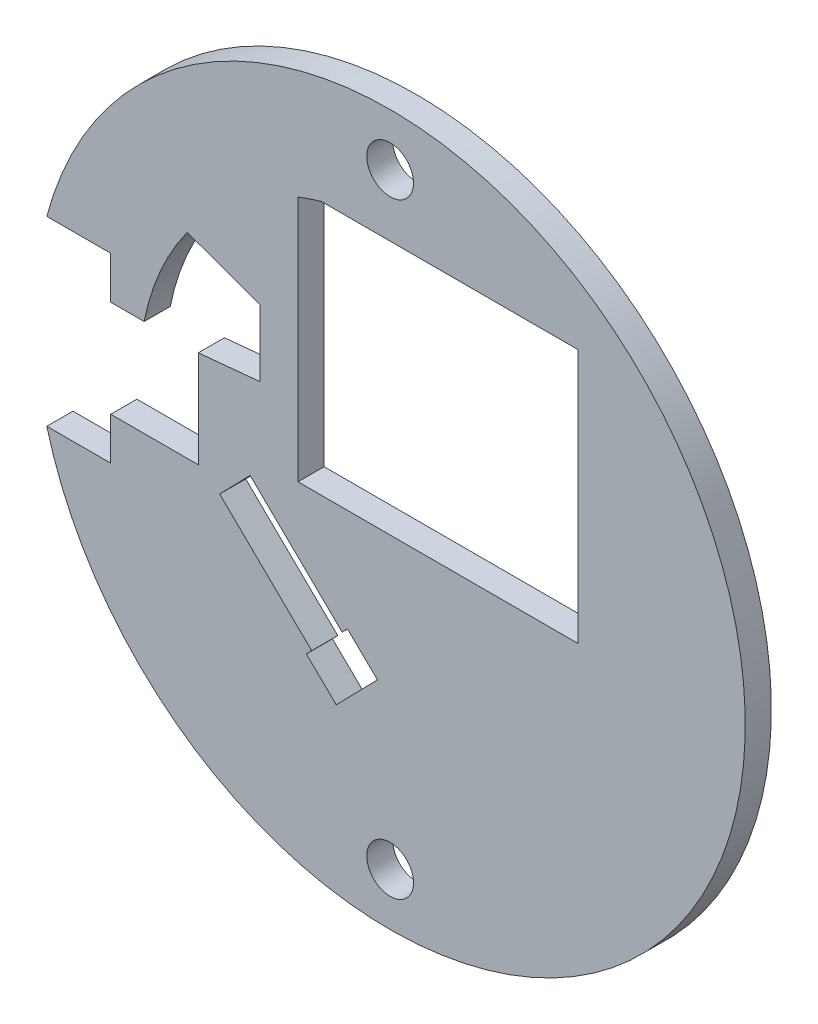
ISO-10303-21;
HEADER;
FILE_DESCRIPTION(('STEP AP214'),'2;1');
FILE_NAME('part.step','',(''),(''),'','','');
FILE_SCHEMA(('AUTOMOTIVE_DESIGN { 1 0 10303 214 1 1 1 1 }'));
ENDSEC;
DATA;
#1=APPLICATION_CONTEXT('core data for automotive mechanical design processes');
#2=APPLICATION_PROTOCOL_DEFINITION('international standard','automotive_design',2000,#1);
#3=PRODUCT_CONTEXT('',#1,'mechanical');
#4=PRODUCT('Part','Part','',(#3));
#5=PRODUCT_RELATED_PRODUCT_CATEGORY('part','',(#4));
#6=PRODUCT_DEFINITION_FORMATION('','',#4);
#7=PRODUCT_DEFINITION_CONTEXT('part definition',#1,'design');
#8=PRODUCT_DEFINITION('design','',#6,#7);
#9=PRODUCT_DEFINITION_SHAPE('','',#8);
#10=(LENGTH_UNIT() NAMED_UNIT(*) SI_UNIT(.MILLI.,.METRE.));
#11=(NAMED_UNIT(*) PLANE_ANGLE_UNIT() SI_UNIT($,.RADIAN.));
#12=(NAMED_UNIT(*) SI_UNIT($,.STERADIAN.) SOLID_ANGLE_UNIT());
#13=UNCERTAINTY_MEASURE_WITH_UNIT(LENGTH_MEASURE(1.E-05),#10,'distance_accuracy_value','');
#14=(GEOMETRIC_REPRESENTATION_CONTEXT(3) GLOBAL_UNCERTAINTY_ASSIGNED_CONTEXT((#13)) GLOBAL_UNIT_ASSIGNED_CONTEXT((#10,
#11,#12)) REPRESENTATION_CONTEXT('',''));
#15=CARTESIAN_POINT('',(0.,0.,0.));
#16=DIRECTION('',(0.,0.,1.));
#17=DIRECTION('',(1.,0.,0.));
#18=AXIS2_PLACEMENT_3D('',#15,#16,#17);
#19=CARTESIAN_POINT('',(-7.9248,0.,1.5875));
#20=DIRECTION('',(-1.,0.,0.));
#21=DIRECTION('',(0.,0.,1.));
#22=AXIS2_PLACEMENT_3D('',#19,#20,#21);
#23=PLANE('',#22);
#24=DIRECTION('',(0.,1.,0.));
#25=VECTOR('',#24,1.);
#26=CARTESIAN_POINT('',(-7.9248,0.,0.));
#27=LINE('',#26,#25);
#28=CARTESIAN_POINT('',(-7.9248,3.302,0.));
#29=VERTEX_POINT('',#28);
#30=CARTESIAN_POINT('',(-7.9248,7.366,0.));
#31=VERTEX_POINT('',#30);
#32=EDGE_CURVE('E286',#29,#31,#27,.T.);
#33=ORIENTED_EDGE('',*,*,#32,.F.);
#34=DIRECTION('',(0.,0.,-1.));
#35=VECTOR('',#34,1.);
#36=CARTESIAN_POINT('',(-7.9248,3.302,1.5875));
#37=LINE('',#36,#35);
#38=CARTESIAN_POINT('',(-7.9248,3.302,1.5875));
#39=VERTEX_POINT('',#38);
#40=EDGE_CURVE('E11',#39,#29,#37,.T.);
#41=ORIENTED_EDGE('',*,*,#40,.F.);
#42=DIRECTION('',(0.,1.,0.));
#43=VECTOR('',#42,1.);
#44=CARTESIAN_POINT('',(-7.9248,0.,1.5875));
#45=LINE('',#44,#43);
#46=CARTESIAN_POINT('',(-7.9248,7.366,1.5875));
#47=VERTEX_POINT('',#46);
#48=EDGE_CURVE('E419',#39,#47,#45,.T.);
#49=ORIENTED_EDGE('',*,*,#48,.T.);
#50=DIRECTION('',(0.,0.,-1.));
#51=VECTOR('',#50,1.);
#52=CARTESIAN_POINT('',(-7.9248,7.366,1.5875));
#53=LINE('',#52,#51);
#54=EDGE_CURVE('E139',#47,#31,#53,.T.);
#55=ORIENTED_EDGE('',*,*,#54,.T.);
#56=EDGE_LOOP('',(#33,#41,#49,#55));
#57=FACE_BOUND('',#56,.T.);
#58=ADVANCED_FACE('F35',(#57),#23,.T.);
#59=CARTESIAN_POINT('',(-0.380118648773103,4.01609515255772,1.5875));
#60=DIRECTION('',(-0.0942276918622993,0.995550672786827,0.));
#61=DIRECTION('',(-0.995550672786827,-0.0942276918622993,0.));
#62=AXIS2_PLACEMENT_3D('',#59,#60,#61);
#63=PLANE('',#62);
#64=DIRECTION('',(0.995550672786827,0.0942276918622993,0.));
#65=VECTOR('',#64,1.);
#66=CARTESIAN_POINT('',(-0.380118648773103,4.01609515255772,0.));
#67=LINE('',#66,#65);
#68=CARTESIAN_POINT('',(-11.6598615597199,2.9484808478801,0.));
#69=VERTEX_POINT('',#68);
#70=EDGE_CURVE('E289',#69,#29,#67,.T.);
#71=ORIENTED_EDGE('',*,*,#70,.F.);
#72=DIRECTION('',(0.,0.,-1.));
#73=VECTOR('',#72,1.);
#74=CARTESIAN_POINT('',(-11.6598615597199,2.9484808478801,1.5875));
#75=LINE('',#74,#73);
#76=CARTESIAN_POINT('',(-11.6598615597199,2.9484808478801,1.5875));
#77=VERTEX_POINT('',#76);
#78=EDGE_CURVE('E45',#77,#69,#75,.T.);
#79=ORIENTED_EDGE('',*,*,#78,.F.);
#80=DIRECTION('',(0.995550672786827,0.0942276918622993,0.));
#81=VECTOR('',#80,1.);
#82=CARTESIAN_POINT('',(-0.380118648773103,4.01609515255772,1.5875));
#83=LINE('',#82,#81);
#84=EDGE_CURVE('E421',#77,#39,#83,.T.);
#85=ORIENTED_EDGE('',*,*,#84,.T.);
#86=ORIENTED_EDGE('',*,*,#40,.T.);
#87=EDGE_LOOP('',(#71,#79,#85,#86));
#88=FACE_BOUND('',#87,.T.);
#89=ADVANCED_FACE('F450',(#88),#63,.T.);
#90=CARTESIAN_POINT('',(-11.6598615597199,0.,1.5875));
#91=DIRECTION('',(1.,0.,0.));
#92=DIRECTION('',(0.,1.,0.));
#93=AXIS2_PLACEMENT_3D('',#90,#91,#92);
#94=PLANE('',#93);
#95=DIRECTION('',(0.,-1.,0.));
#96=VECTOR('',#95,1.);
#97=CARTESIAN_POINT('',(-11.6598615597199,0.,0.));
#98=LINE('',#97,#96);
#99=CARTESIAN_POINT('',(-11.6598615597199,-2.9484808478801,0.));
#100=VERTEX_POINT('',#99);
#101=EDGE_CURVE('E292',#69,#100,#98,.T.);
#102=ORIENTED_EDGE('',*,*,#101,.T.);
#103=DIRECTION('',(0.,0.,-1.));
#104=VECTOR('',#103,1.);
#105=CARTESIAN_POINT('',(-11.6598615597199,-2.9484808478801,1.5875));
#106=LINE('',#105,#104);
#107=CARTESIAN_POINT('',(-11.6598615597199,-2.9484808478801,1.5875));
#108=VERTEX_POINT('',#107);
#109=EDGE_CURVE('E341',#108,#100,#106,.T.);
#110=ORIENTED_EDGE('',*,*,#109,.F.);
#111=DIRECTION('',(0.,-1.,0.));
#112=VECTOR('',#111,1.);
#113=CARTESIAN_POINT('',(-11.6598615597199,0.,1.5875));
#114=LINE('',#113,#112);
#115=EDGE_CURVE('E424',#77,#108,#114,.T.);
#116=ORIENTED_EDGE('',*,*,#115,.F.);
#117=ORIENTED_EDGE('',*,*,#78,.T.);
#118=EDGE_LOOP('',(#102,#110,#116,#117));
#119=FACE_BOUND('',#118,.T.);
#120=ADVANCED_FACE('F455',(#119),#94,.F.);
#121=CARTESIAN_POINT('',(0.,-2.9484808478801,1.5875));
#122=DIRECTION('',(0.,-1.,0.));
#123=DIRECTION('',(0.,0.,-1.));
#124=AXIS2_PLACEMENT_3D('',#121,#122,#123);
#125=PLANE('',#124);
#126=DIRECTION('',(-1.,0.,0.));
#127=VECTOR('',#126,1.);
#128=CARTESIAN_POINT('',(0.,-2.9484808478801,0.));
#129=LINE('',#128,#127);
#130=CARTESIAN_POINT('',(-16.9840587441892,-2.9484808478801,0.));
#131=VERTEX_POINT('',#130);
#132=EDGE_CURVE('E295',#100,#131,#129,.T.);
#133=ORIENTED_EDGE('',*,*,#132,.T.);
#134=DIRECTION('',(0.,0.,-1.));
#135=VECTOR('',#134,1.);
#136=CARTESIAN_POINT('',(-16.9840587441892,-2.9484808478801,1.5875));
#137=LINE('',#136,#135);
#138=CARTESIAN_POINT('',(-16.9840587441892,-2.9484808478801,1.5875));
#139=VERTEX_POINT('',#138);
#140=EDGE_CURVE('E338',#139,#131,#137,.T.);
#141=ORIENTED_EDGE('',*,*,#140,.F.);
#142=DIRECTION('',(-1.,0.,0.));
#143=VECTOR('',#142,1.);
#144=CARTESIAN_POINT('',(0.,-2.9484808478801,1.5875));
#145=LINE('',#144,#143);
#146=EDGE_CURVE('E427',#108,#139,#145,.T.);
#147=ORIENTED_EDGE('',*,*,#146,.F.);
#148=ORIENTED_EDGE('',*,*,#109,.T.);
#149=EDGE_LOOP('',(#133,#141,#147,#148));
#150=FACE_BOUND('',#149,.T.);
#151=ADVANCED_FACE('F459',(#150),#125,.F.);
#152=CARTESIAN_POINT('',(-16.9840587441892,0.,1.5875));
#153=DIRECTION('',(1.,0.,0.));
#154=DIRECTION('',(0.,0.,-1.));
#155=AXIS2_PLACEMENT_3D('',#152,#153,#154);
#156=PLANE('',#155);
#157=DIRECTION('',(0.,-1.,0.));
#158=VECTOR('',#157,1.);
#159=CARTESIAN_POINT('',(-16.9840587441892,0.,0.));
#160=LINE('',#159,#158);
#161=CARTESIAN_POINT('',(-16.9840587441892,-5.5245,0.));
#162=VERTEX_POINT('',#161);
#163=EDGE_CURVE('E298',#131,#162,#160,.T.);
#164=ORIENTED_EDGE('',*,*,#163,.T.);
#165=DIRECTION('',(0.,0.,-1.));
#166=VECTOR('',#165,1.);
#167=CARTESIAN_POINT('',(-16.9840587441892,-5.5245,1.5875));
#168=LINE('',#167,#166);
#169=CARTESIAN_POINT('',(-16.9840587441892,-5.5245,1.5875));
#170=VERTEX_POINT('',#169);
#171=EDGE_CURVE('E335',#170,#162,#168,.T.);
#172=ORIENTED_EDGE('',*,*,#171,.F.);
#173=DIRECTION('',(0.,-1.,0.));
#174=VECTOR('',#173,1.);
#175=CARTESIAN_POINT('',(-16.9840587441892,0.,1.5875));
#176=LINE('',#175,#174);
#177=EDGE_CURVE('E430',#139,#170,#176,.T.);
#178=ORIENTED_EDGE('',*,*,#177,.F.);
#179=ORIENTED_EDGE('',*,*,#140,.T.);
#180=EDGE_LOOP('',(#164,#172,#178,#179));
#181=FACE_BOUND('',#180,.T.);
#182=ADVANCED_FACE('F461',(#181),#156,.F.);
#183=CARTESIAN_POINT('',(0.,-5.5245,1.5875));
#184=DIRECTION('',(0.,-1.,0.));
#185=DIRECTION('',(1.,0.,0.));
#186=AXIS2_PLACEMENT_3D('',#183,#184,#185);
#187=PLANE('',#186);
#188=DIRECTION('',(-1.,0.,0.));
#189=VECTOR('',#188,1.);
#190=CARTESIAN_POINT('',(0.,-5.5245,0.));
#191=LINE('',#190,#189);
#192=CARTESIAN_POINT('',(-20.8712242034338,-5.5245,0.));
#193=VERTEX_POINT('',#192);
#194=EDGE_CURVE('E301',#162,#193,#191,.T.);
#195=ORIENTED_EDGE('',*,*,#194,.T.);
#196=DIRECTION('',(0.,0.,-1.));
#197=VECTOR('',#196,1.);
#198=CARTESIAN_POINT('',(-20.8712242034338,-5.5245,1.5875));
#199=LINE('',#198,#197);
#200=CARTESIAN_POINT('',(-20.8712242034338,-5.5245,1.5875));
#201=VERTEX_POINT('',#200);
#202=EDGE_CURVE('E332',#201,#193,#199,.T.);
#203=ORIENTED_EDGE('',*,*,#202,.F.);
#204=DIRECTION('',(-1.,0.,0.));
#205=VECTOR('',#204,1.);
#206=CARTESIAN_POINT('',(0.,-5.5245,1.5875));
#207=LINE('',#206,#205);
#208=EDGE_CURVE('E433',#170,#201,#207,.T.);
#209=ORIENTED_EDGE('',*,*,#208,.F.);
#210=ORIENTED_EDGE('',*,*,#171,.T.);
#211=EDGE_LOOP('',(#195,#203,#209,#210));
#212=FACE_BOUND('',#211,.T.);
#213=ADVANCED_FACE('F463',(#212),#187,.F.);
#214=CARTESIAN_POINT('',(0.,0.,1.5875));
#215=DIRECTION('',(0.,0.,-1.));
#216=DIRECTION('',(-1.,0.,0.));
#217=AXIS2_PLACEMENT_3D('',#214,#215,#216);
#218=CYLINDRICAL_SURFACE('',#217,21.59);
#219=CARTESIAN_POINT('',(0.,0.,0.));
#220=DIRECTION('',(0.,0.,1.));
#221=DIRECTION('',(1.,0.,0.));
#222=AXIS2_PLACEMENT_3D('',#219,#220,#221);
#223=CIRCLE('',#222,21.59);
#224=CARTESIAN_POINT('',(-20.8712242034338,5.5245,0.));
#225=VERTEX_POINT('',#224);
#226=EDGE_CURVE('E304',#193,#225,#223,.T.);
#227=ORIENTED_EDGE('',*,*,#226,.T.);
#228=DIRECTION('',(0.,0.,-1.));
#229=VECTOR('',#228,1.);
#230=CARTESIAN_POINT('',(-20.8712242034338,5.5245,1.5875));
#231=LINE('',#230,#229);
#232=CARTESIAN_POINT('',(-20.8712242034338,5.5245,1.5875));
#233=VERTEX_POINT('',#232);
#234=EDGE_CURVE('E330',#233,#225,#231,.T.);
#235=ORIENTED_EDGE('',*,*,#234,.F.);
#236=CARTESIAN_POINT('',(0.,0.,1.5875));
#237=DIRECTION('',(0.,0.,1.));
#238=DIRECTION('',(1.,0.,0.));
#239=AXIS2_PLACEMENT_3D('',#236,#237,#238);
#240=CIRCLE('',#239,21.59);
#241=EDGE_CURVE('E436',#201,#233,#240,.T.);
#242=ORIENTED_EDGE('',*,*,#241,.F.);
#243=ORIENTED_EDGE('',*,*,#202,.T.);
#244=EDGE_LOOP('',(#227,#235,#242,#243));
#245=FACE_BOUND('',#244,.T.);
#246=ADVANCED_FACE('F467',(#245),#218,.T.);
#247=CARTESIAN_POINT('',(0.,5.5245,1.5875));
#248=DIRECTION('',(0.,-1.,0.));
#249=DIRECTION('',(0.,0.,-1.));
#250=AXIS2_PLACEMENT_3D('',#247,#248,#249);
#251=PLANE('',#250);
#252=DIRECTION('',(-1.,0.,0.));
#253=VECTOR('',#252,1.);
#254=CARTESIAN_POINT('',(0.,5.5245,0.));
#255=LINE('',#254,#253);
#256=CARTESIAN_POINT('',(-16.9840587441892,5.5245,0.));
#257=VERTEX_POINT('',#256);
#258=EDGE_CURVE('E307',#257,#225,#255,.T.);
#259=ORIENTED_EDGE('',*,*,#258,.F.);
#260=DIRECTION('',(0.,0.,-1.));
#261=VECTOR('',#260,1.);
#262=CARTESIAN_POINT('',(-16.9840587441892,5.5245,1.5875));
#263=LINE('',#262,#261);
#264=CARTESIAN_POINT('',(-16.9840587441892,5.5245,1.5875));
#265=VERTEX_POINT('',#264);
#266=EDGE_CURVE('E328',#265,#257,#263,.T.);
#267=ORIENTED_EDGE('',*,*,#266,.F.);
#268=DIRECTION('',(-1.,0.,0.));
#269=VECTOR('',#268,1.);
#270=CARTESIAN_POINT('',(0.,5.5245,1.5875));
#271=LINE('',#270,#269);
#272=EDGE_CURVE('E438',#265,#233,#271,.T.);
#273=ORIENTED_EDGE('',*,*,#272,.T.);
#274=ORIENTED_EDGE('',*,*,#234,.T.);
#275=EDGE_LOOP('',(#259,#267,#273,#274));
#276=FACE_BOUND('',#275,.T.);
#277=ADVANCED_FACE('F469',(#276),#251,.T.);
#278=CARTESIAN_POINT('',(-16.9840587441892,0.,1.5875));
#279=DIRECTION('',(-1.,0.,0.));
#280=DIRECTION('',(0.,0.,1.));
#281=AXIS2_PLACEMENT_3D('',#278,#279,#280);
#282=PLANE('',#281);
#283=DIRECTION('',(0.,1.,0.));
#284=VECTOR('',#283,1.);
#285=CARTESIAN_POINT('',(-16.9840587441892,0.,0.));
#286=LINE('',#285,#284);
#287=CARTESIAN_POINT('',(-16.9840587441892,2.9484808478801,0.));
#288=VERTEX_POINT('',#287);
#289=EDGE_CURVE('E310',#288,#257,#286,.T.);
#290=ORIENTED_EDGE('',*,*,#289,.F.);
#291=DIRECTION('',(0.,0.,-1.));
#292=VECTOR('',#291,1.);
#293=CARTESIAN_POINT('',(-16.9840587441892,2.9484808478801,1.5875));
#294=LINE('',#293,#292);
#295=CARTESIAN_POINT('',(-16.9840587441892,2.9484808478801,1.5875));
#296=VERTEX_POINT('',#295);
#297=EDGE_CURVE('E225',#296,#288,#294,.T.);
#298=ORIENTED_EDGE('',*,*,#297,.F.);
#299=DIRECTION('',(0.,1.,0.));
#300=VECTOR('',#299,1.);
#301=CARTESIAN_POINT('',(-16.9840587441892,0.,1.5875));
#302=LINE('',#301,#300);
#303=EDGE_CURVE('E233',#296,#265,#302,.T.);
#304=ORIENTED_EDGE('',*,*,#303,.T.);
#305=ORIENTED_EDGE('',*,*,#266,.T.);
#306=EDGE_LOOP('',(#290,#298,#304,#305));
#307=FACE_BOUND('',#306,.T.);
#308=ADVANCED_FACE('F442',(#307),#282,.T.);
#309=CARTESIAN_POINT('',(0.,2.9484808478801,1.5875));
#310=DIRECTION('',(0.,-1.,0.));
#311=DIRECTION('',(0.,0.,-1.));
#312=AXIS2_PLACEMENT_3D('',#309,#310,#311);
#313=PLANE('',#312);
#314=DIRECTION('',(-1.,0.,0.));
#315=VECTOR('',#314,1.);
#316=CARTESIAN_POINT('',(0.,2.9484808478801,0.));
#317=LINE('',#316,#315);
#318=CARTESIAN_POINT('',(-14.9520587441892,2.9484808478801,0.));
#319=VERTEX_POINT('',#318);
#320=EDGE_CURVE('E220',#319,#288,#317,.T.);
#321=ORIENTED_EDGE('',*,*,#320,.F.);
#322=DIRECTION('',(0.,0.,-1.));
#323=VECTOR('',#322,1.);
#324=CARTESIAN_POINT('',(-14.9520587441892,2.9484808478801,1.5875));
#325=LINE('',#324,#323);
#326=CARTESIAN_POINT('',(-14.9520587441892,2.9484808478801,1.5875));
#327=VERTEX_POINT('',#326);
#328=EDGE_CURVE('E215',#327,#319,#325,.T.);
#329=ORIENTED_EDGE('',*,*,#328,.F.);
#330=DIRECTION('',(-1.,0.,0.));
#331=VECTOR('',#330,1.);
#332=CARTESIAN_POINT('',(0.,2.9484808478801,1.5875));
#333=LINE('',#332,#331);
#334=EDGE_CURVE('E218',#327,#296,#333,.T.);
#335=ORIENTED_EDGE('',*,*,#334,.T.);
#336=ORIENTED_EDGE('',*,*,#297,.T.);
#337=EDGE_LOOP('',(#321,#329,#335,#336));
#338=FACE_BOUND('',#337,.T.);
#339=ADVANCED_FACE('F217',(#338),#313,.T.);
#340=CARTESIAN_POINT('',(0.,0.,1.5875));
#341=DIRECTION('',(0.,0.,-1.));
#342=DIRECTION('',(-1.,0.,0.));
#343=AXIS2_PLACEMENT_3D('',#340,#341,#342);
#344=CYLINDRICAL_SURFACE('',#343,15.24);
#345=CARTESIAN_POINT('',(0.,0.,0.));
#346=DIRECTION('',(0.,0.,1.));
#347=DIRECTION('',(1.,0.,0.));
#348=AXIS2_PLACEMENT_3D('',#345,#346,#347);
#349=CIRCLE('',#348,15.24);
#350=CARTESIAN_POINT('',(-12.3325762819453,8.9535,0.));
#351=VERTEX_POINT('',#350);
#352=EDGE_CURVE('E314',#351,#319,#349,.T.);
#353=ORIENTED_EDGE('',*,*,#352,.F.);
#354=DIRECTION('',(0.,0.,-1.));
#355=VECTOR('',#354,1.);
#356=CARTESIAN_POINT('',(-12.3325762819453,8.9535,1.5875));
#357=LINE('',#356,#355);
#358=CARTESIAN_POINT('',(-12.3325762819453,8.9535,1.5875));
#359=VERTEX_POINT('',#358);
#360=EDGE_CURVE('E132',#359,#351,#357,.T.);
#361=ORIENTED_EDGE('',*,*,#360,.F.);
#362=CARTESIAN_POINT('',(0.,0.,1.5875));
#363=DIRECTION('',(0.,0.,1.));
#364=DIRECTION('',(1.,0.,0.));
#365=AXIS2_PLACEMENT_3D('',#362,#363,#364);
#366=CIRCLE('',#365,15.24);
#367=EDGE_CURVE('E230',#359,#327,#366,.T.);
#368=ORIENTED_EDGE('',*,*,#367,.T.);
#369=ORIENTED_EDGE('',*,*,#328,.T.);
#370=EDGE_LOOP('',(#353,#361,#368,#369));
#371=FACE_BOUND('',#370,.T.);
#372=ADVANCED_FACE('F235',(#371),#344,.F.);
#373=CARTESIAN_POINT('',(2.19480084961102,-2.13801833128113,1.5875));
#374=DIRECTION('',(0.716312056737598,-0.697780078085031,0.));
#375=DIRECTION('',(0.697780078085031,0.716312056737598,0.));
#376=AXIS2_PLACEMENT_3D('',#373,#374,#375);
#377=PLANE('',#376);
#378=DIRECTION('',(-0.697780078085031,-0.716312056737598,0.));
#379=VECTOR('',#378,1.);
#380=CARTESIAN_POINT('',(2.19480084961102,-2.13801833128113,0.));
#381=LINE('',#380,#379);
#382=CARTESIAN_POINT('',(-4.76970624057092,-9.28749214776329,0.));
#383=VERTEX_POINT('',#382);
#384=CARTESIAN_POINT('',(-5.09316219576723,-9.619538601664,0.));
#385=VERTEX_POINT('',#384);
#386=EDGE_CURVE('E262',#383,#385,#381,.T.);
#387=ORIENTED_EDGE('',*,*,#386,.F.);
#388=DIRECTION('',(0.,0.,-1.));
#389=VECTOR('',#388,1.);
#390=CARTESIAN_POINT('',(-4.76970624057092,-9.28749214776329,1.5875));
#391=LINE('',#390,#389);
#392=CARTESIAN_POINT('',(-4.76970624057092,-9.28749214776329,1.5875));
#393=VERTEX_POINT('',#392);
#394=EDGE_CURVE('E325',#393,#383,#391,.T.);
#395=ORIENTED_EDGE('',*,*,#394,.F.);
#396=DIRECTION('',(-0.697780078085031,-0.716312056737598,0.));
#397=VECTOR('',#396,1.);
#398=CARTESIAN_POINT('',(2.19480084961102,-2.13801833128113,1.5875));
#399=LINE('',#398,#397);
#400=CARTESIAN_POINT('',(-5.09316219576723,-9.619538601664,1.5875));
#401=VERTEX_POINT('',#400);
#402=EDGE_CURVE('E393',#393,#401,#399,.T.);
#403=ORIENTED_EDGE('',*,*,#402,.T.);
#404=DIRECTION('',(0.,0.,-1.));
#405=VECTOR('',#404,1.);
#406=CARTESIAN_POINT('',(-5.09316219576723,-9.619538601664,1.5875));
#407=LINE('',#406,#405);
#408=EDGE_CURVE('E345',#401,#385,#407,.T.);
#409=ORIENTED_EDGE('',*,*,#408,.T.);
#410=EDGE_LOOP('',(#387,#395,#403,#409));
#411=FACE_BOUND('',#410,.T.);
#412=ADVANCED_FACE('F514',(#411),#377,.T.);
#413=CARTESIAN_POINT('',(-6.96450709018199,-7.14947381648206,1.5875));
#414=DIRECTION('',(0.697780078085039,0.71631205673759,0.));
#415=DIRECTION('',(-0.71631205673759,0.697780078085039,0.));
#416=AXIS2_PLACEMENT_3D('',#413,#414,#415);
#417=PLANE('',#416);
#418=DIRECTION('',(0.71631205673759,-0.697780078085039,0.));
#419=VECTOR('',#418,1.);
#420=CARTESIAN_POINT('',(-6.96450709018199,-7.14947381648206,0.));
#421=LINE('',#420,#419);
#422=CARTESIAN_POINT('',(-10.3644615597199,-3.83748084788009,0.));
#423=VERTEX_POINT('',#422);
#424=EDGE_CURVE('E265',#423,#383,#421,.T.);
#425=ORIENTED_EDGE('',*,*,#424,.F.);
#426=DIRECTION('',(0.,0.,-1.));
#427=VECTOR('',#426,1.);
#428=CARTESIAN_POINT('',(-10.3644615597199,-3.83748084788009,1.5875));
#429=LINE('',#428,#427);
#430=CARTESIAN_POINT('',(-10.3644615597199,-3.83748084788009,1.5875));
#431=VERTEX_POINT('',#430);
#432=EDGE_CURVE('E357',#431,#423,#429,.T.);
#433=ORIENTED_EDGE('',*,*,#432,.F.);
#434=DIRECTION('',(0.71631205673759,-0.697780078085039,0.));
#435=VECTOR('',#434,1.);
#436=CARTESIAN_POINT('',(-6.96450709018199,-7.14947381648206,1.5875));
#437=LINE('',#436,#435);
#438=EDGE_CURVE('E399',#431,#393,#437,.T.);
#439=ORIENTED_EDGE('',*,*,#438,.T.);
#440=ORIENTED_EDGE('',*,*,#394,.T.);
#441=EDGE_LOOP('',(#425,#433,#439,#440));
#442=FACE_BOUND('',#441,.T.);
#443=ADVANCED_FACE('F510',(#442),#417,.T.);
#444=CARTESIAN_POINT('',(-3.39995446953787,3.31199296860197,1.5875));
#445=DIRECTION('',(0.71631205673759,-0.697780078085039,0.));
#446=DIRECTION('',(0.697780078085039,0.71631205673759,0.));
#447=AXIS2_PLACEMENT_3D('',#444,#445,#446);
#448=PLANE('',#447);
#449=DIRECTION('',(-0.697780078085039,-0.71631205673759,0.));
#450=VECTOR('',#449,1.);
#451=CARTESIAN_POINT('',(-3.39995446953787,3.31199296860197,0.));
#452=LINE('',#451,#450);
#453=CARTESIAN_POINT('',(-8.51234389845874,-1.93617375568151,0.));
#454=VERTEX_POINT('',#453);
#455=EDGE_CURVE('E268',#454,#423,#452,.T.);
#456=ORIENTED_EDGE('',*,*,#455,.F.);
#457=DIRECTION('',(0.,0.,-1.));
#458=VECTOR('',#457,1.);
#459=CARTESIAN_POINT('',(-8.51234389845874,-1.93617375568151,1.5875));
#460=LINE('',#459,#458);
#461=CARTESIAN_POINT('',(-8.51234389845874,-1.93617375568151,1.5875));
#462=VERTEX_POINT('',#461);
#463=EDGE_CURVE('E355',#462,#454,#460,.T.);
#464=ORIENTED_EDGE('',*,*,#463,.F.);
#465=DIRECTION('',(-0.697780078085039,-0.71631205673759,0.));
#466=VECTOR('',#465,1.);
#467=CARTESIAN_POINT('',(-3.39995446953787,3.31199296860197,1.5875));
#468=LINE('',#467,#466);
#469=EDGE_CURVE('E402',#462,#431,#468,.T.);
#470=ORIENTED_EDGE('',*,*,#469,.T.);
#471=ORIENTED_EDGE('',*,*,#432,.T.);
#472=EDGE_LOOP('',(#456,#464,#470,#471));
#473=FACE_BOUND('',#472,.T.);
#474=ADVANCED_FACE('F506',(#473),#448,.T.);
#475=CARTESIAN_POINT('',(-5.11238942892088,-5.24816672428347,1.5875));
#476=DIRECTION('',(-0.697780078085039,-0.71631205673759,0.));
#477=DIRECTION('',(0.71631205673759,-0.697780078085039,0.));
#478=AXIS2_PLACEMENT_3D('',#475,#476,#477);
#479=PLANE('',#478);
#480=DIRECTION('',(-0.71631205673759,0.697780078085039,0.));
#481=VECTOR('',#480,1.);
#482=CARTESIAN_POINT('',(-5.11238942892088,-5.24816672428347,0.));
#483=LINE('',#482,#481);
#484=CARTESIAN_POINT('',(-2.9175885793098,-7.3861850555647,0.));
#485=VERTEX_POINT('',#484);
#486=EDGE_CURVE('E271',#485,#454,#483,.T.);
#487=ORIENTED_EDGE('',*,*,#486,.F.);
#488=DIRECTION('',(0.,0.,-1.));
#489=VECTOR('',#488,1.);
#490=CARTESIAN_POINT('',(-2.9175885793098,-7.3861850555647,1.5875));
#491=LINE('',#490,#489);
#492=CARTESIAN_POINT('',(-2.9175885793098,-7.3861850555647,1.5875));
#493=VERTEX_POINT('',#492);
#494=EDGE_CURVE('E353',#493,#485,#491,.T.);
#495=ORIENTED_EDGE('',*,*,#494,.F.);
#496=DIRECTION('',(-0.71631205673759,0.697780078085039,0.));
#497=VECTOR('',#496,1.);
#498=CARTESIAN_POINT('',(-5.11238942892088,-5.24816672428347,1.5875));
#499=LINE('',#498,#497);
#500=EDGE_CURVE('E405',#493,#462,#499,.T.);
#501=ORIENTED_EDGE('',*,*,#500,.T.);
#502=ORIENTED_EDGE('',*,*,#463,.T.);
#503=EDGE_LOOP('',(#487,#495,#501,#502));
#504=FACE_BOUND('',#503,.T.);
#505=ADVANCED_FACE('F502',(#504),#479,.T.);
#506=CARTESIAN_POINT('',(2.19480084961111,-2.13801833128132,1.5875));
#507=DIRECTION('',(0.716312056737581,-0.697780078085048,0.));
#508=DIRECTION('',(0.697780078085048,0.716312056737581,0.));
#509=AXIS2_PLACEMENT_3D('',#506,#507,#508);
#510=PLANE('',#509);
#511=DIRECTION('',(-0.697780078085048,-0.716312056737581,0.));
#512=VECTOR('',#511,1.);
#513=CARTESIAN_POINT('',(2.19480084961111,-2.13801833128132,0.));
#514=LINE('',#513,#512);
#515=CARTESIAN_POINT('',(-2.59413262411347,-7.05413860166399,0.));
#516=VERTEX_POINT('',#515);
#517=EDGE_CURVE('E274',#516,#485,#514,.T.);
#518=ORIENTED_EDGE('',*,*,#517,.F.);
#519=DIRECTION('',(0.,0.,-1.));
#520=VECTOR('',#519,1.);
#521=CARTESIAN_POINT('',(-2.59413262411347,-7.05413860166399,1.5875));
#522=LINE('',#521,#520);
#523=CARTESIAN_POINT('',(-2.59413262411347,-7.05413860166399,1.5875));
#524=VERTEX_POINT('',#523);
#525=EDGE_CURVE('E351',#524,#516,#522,.T.);
#526=ORIENTED_EDGE('',*,*,#525,.F.);
#527=DIRECTION('',(-0.697780078085048,-0.716312056737581,0.));
#528=VECTOR('',#527,1.);
#529=CARTESIAN_POINT('',(2.19480084961111,-2.13801833128132,1.5875));
#530=LINE('',#529,#528);
#531=EDGE_CURVE('E408',#524,#493,#530,.T.);
#532=ORIENTED_EDGE('',*,*,#531,.T.);
#533=ORIENTED_EDGE('',*,*,#494,.T.);
#534=EDGE_LOOP('',(#518,#526,#532,#533));
#535=FACE_BOUND('',#534,.T.);
#536=ADVANCED_FACE('F498',(#535),#510,.T.);
#537=CARTESIAN_POINT('',(-4.78893347372455,-4.91612027038276,1.5875));
#538=DIRECTION('',(-0.697780078085039,-0.71631205673759,0.));
#539=DIRECTION('',(0.71631205673759,-0.697780078085039,0.));
#540=AXIS2_PLACEMENT_3D('',#537,#538,#539);
#541=PLANE('',#540);
#542=DIRECTION('',(-0.71631205673759,0.697780078085039,0.));
#543=VECTOR('',#542,1.);
#544=CARTESIAN_POINT('',(-4.78893347372455,-4.91612027038276,0.));
#545=LINE('',#544,#543);
#546=CARTESIAN_POINT('',(-0.774699999999994,-8.82649999999999,0.));
#547=VERTEX_POINT('',#546);
#548=EDGE_CURVE('E277',#547,#516,#545,.T.);
#549=ORIENTED_EDGE('',*,*,#548,.F.);
#550=DIRECTION('',(0.,0.,-1.));
#551=VECTOR('',#550,1.);
#552=CARTESIAN_POINT('',(-0.774699999999994,-8.82649999999999,1.5875));
#553=LINE('',#552,#551);
#554=CARTESIAN_POINT('',(-0.774699999999994,-8.82649999999999,1.5875));
#555=VERTEX_POINT('',#554);
#556=EDGE_CURVE('E349',#555,#547,#553,.T.);
#557=ORIENTED_EDGE('',*,*,#556,.F.);
#558=DIRECTION('',(-0.71631205673759,0.697780078085039,0.));
#559=VECTOR('',#558,1.);
#560=CARTESIAN_POINT('',(-4.78893347372455,-4.91612027038276,1.5875));
#561=LINE('',#560,#559);
#562=EDGE_CURVE('E411',#555,#524,#561,.T.);
#563=ORIENTED_EDGE('',*,*,#562,.T.);
#564=ORIENTED_EDGE('',*,*,#525,.T.);
#565=EDGE_LOOP('',(#549,#557,#563,#564));
#566=FACE_BOUND('',#565,.T.);
#567=ADVANCED_FACE('F494',(#566),#541,.T.);
#568=CARTESIAN_POINT('',(4.01423347372456,-3.91037972961723,1.5875));
#569=DIRECTION('',(0.71631205673759,-0.697780078085039,0.));
#570=DIRECTION('',(0.697780078085039,0.71631205673759,0.));
#571=AXIS2_PLACEMENT_3D('',#568,#569,#570);
#572=PLANE('',#571);
#573=DIRECTION('',(-0.697780078085039,-0.71631205673759,0.));
#574=VECTOR('',#573,1.);
#575=CARTESIAN_POINT('',(4.01423347372456,-3.91037972961723,0.));
#576=LINE('',#575,#574);
#577=CARTESIAN_POINT('',(-3.27372957165375,-11.3919,0.));
#578=VERTEX_POINT('',#577);
#579=EDGE_CURVE('E280',#547,#578,#576,.T.);
#580=ORIENTED_EDGE('',*,*,#579,.T.);
#581=DIRECTION('',(0.,0.,-1.));
#582=VECTOR('',#581,1.);
#583=CARTESIAN_POINT('',(-3.27372957165375,-11.3919,1.5875));
#584=LINE('',#583,#582);
#585=CARTESIAN_POINT('',(-3.27372957165375,-11.3919,1.5875));
#586=VERTEX_POINT('',#585);
#587=EDGE_CURVE('E347',#586,#578,#584,.T.);
#588=ORIENTED_EDGE('',*,*,#587,.F.);
#589=DIRECTION('',(-0.697780078085039,-0.71631205673759,0.));
#590=VECTOR('',#589,1.);
#591=CARTESIAN_POINT('',(4.01423347372456,-3.91037972961723,1.5875));
#592=LINE('',#591,#590);
#593=EDGE_CURVE('E414',#555,#586,#592,.T.);
#594=ORIENTED_EDGE('',*,*,#593,.F.);
#595=ORIENTED_EDGE('',*,*,#556,.T.);
#596=EDGE_LOOP('',(#580,#588,#594,#595));
#597=FACE_BOUND('',#596,.T.);
#598=ADVANCED_FACE('F491',(#597),#572,.F.);
#599=CARTESIAN_POINT('',(11.43,0.,1.5875));
#600=DIRECTION('',(1.,0.,0.));
#601=DIRECTION('',(0.,1.,0.));
#602=AXIS2_PLACEMENT_3D('',#599,#600,#601);
#603=PLANE('',#602);
#604=DIRECTION('',(0.,-1.,0.));
#605=VECTOR('',#604,1.);
#606=CARTESIAN_POINT('',(11.43,0.,0.));
#607=LINE('',#606,#605);
#608=CARTESIAN_POINT('',(11.43,14.6558,0.));
#609=VERTEX_POINT('',#608);
#610=CARTESIAN_POINT('',(11.43,-0.812799999999999,0.));
#611=VERTEX_POINT('',#610);
#612=EDGE_CURVE('E247',#609,#611,#607,.T.);
#613=ORIENTED_EDGE('',*,*,#612,.T.);
#614=DIRECTION('',(0.,0.,-1.));
#615=VECTOR('',#614,1.);
#616=CARTESIAN_POINT('',(11.43,-0.812799999999999,1.5875));
#617=LINE('',#616,#615);
#618=CARTESIAN_POINT('',(11.43,-0.812799999999999,1.5875));
#619=VERTEX_POINT('',#618);
#620=EDGE_CURVE('E39',#619,#611,#617,.T.);
#621=ORIENTED_EDGE('',*,*,#620,.F.);
#622=DIRECTION('',(0.,-1.,0.));
#623=VECTOR('',#622,1.);
#624=CARTESIAN_POINT('',(11.43,0.,1.5875));
#625=LINE('',#624,#623);
#626=CARTESIAN_POINT('',(11.43,14.6558,1.5875));
#627=VERTEX_POINT('',#626);
#628=EDGE_CURVE('E147',#627,#619,#625,.T.);
#629=ORIENTED_EDGE('',*,*,#628,.F.);
#630=DIRECTION('',(0.,0.,-1.));
#631=VECTOR('',#630,1.);
#632=CARTESIAN_POINT('',(11.43,14.6558,1.5875));
#633=LINE('',#632,#631);
#634=EDGE_CURVE('E246',#627,#609,#633,.T.);
#635=ORIENTED_EDGE('',*,*,#634,.T.);
#636=EDGE_LOOP('',(#613,#621,#629,#635));
#637=FACE_BOUND('',#636,.T.);
#638=ADVANCED_FACE('F37',(#637),#603,.F.);
#639=CARTESIAN_POINT('',(0.,-0.812799999999999,1.5875));
#640=DIRECTION('',(0.,1.,0.));
#641=DIRECTION('',(0.,0.,1.));
#642=AXIS2_PLACEMENT_3D('',#639,#640,#641);
#643=PLANE('',#642);
#644=DIRECTION('',(1.,0.,0.));
#645=VECTOR('',#644,1.);
#646=CARTESIAN_POINT('',(0.,-0.812799999999999,0.));
#647=LINE('',#646,#645);
#648=CARTESIAN_POINT('',(-5.6007,-0.812799999999999,0.));
#649=VERTEX_POINT('',#648);
#650=EDGE_CURVE('E250',#649,#611,#647,.T.);
#651=ORIENTED_EDGE('',*,*,#650,.F.);
#652=DIRECTION('',(0.,0.,-1.));
#653=VECTOR('',#652,1.);
#654=CARTESIAN_POINT('',(-5.6007,-0.812799999999999,1.5875));
#655=LINE('',#654,#653);
#656=CARTESIAN_POINT('',(-5.6007,-0.812799999999999,1.5875));
#657=VERTEX_POINT('',#656);
#658=EDGE_CURVE('E364',#657,#649,#655,.T.);
#659=ORIENTED_EDGE('',*,*,#658,.F.);
#660=DIRECTION('',(1.,0.,0.));
#661=VECTOR('',#660,1.);
#662=CARTESIAN_POINT('',(0.,-0.812799999999999,1.5875));
#663=LINE('',#662,#661);
#664=EDGE_CURVE('E372',#657,#619,#663,.T.);
#665=ORIENTED_EDGE('',*,*,#664,.T.);
#666=ORIENTED_EDGE('',*,*,#620,.T.);
#667=EDGE_LOOP('',(#651,#659,#665,#666));
#668=FACE_BOUND('',#667,.T.);
#669=ADVANCED_FACE('F371',(#668),#643,.T.);
#670=CARTESIAN_POINT('',(-5.6007,0.,1.5875));
#671=DIRECTION('',(1.,0.,0.));
#672=DIRECTION('',(0.,1.,0.));
#673=AXIS2_PLACEMENT_3D('',#670,#671,#672);
#674=PLANE('',#673);
#675=DIRECTION('',(0.,-1.,0.));
#676=VECTOR('',#675,1.);
#677=CARTESIAN_POINT('',(-5.6007,0.,0.));
#678=LINE('',#677,#676);
#679=CARTESIAN_POINT('',(-5.6007,14.1735584632089,0.));
#680=VERTEX_POINT('',#679);
#681=EDGE_CURVE('E253',#680,#649,#678,.T.);
#682=ORIENTED_EDGE('',*,*,#681,.F.);
#683=DIRECTION('',(0.,0.,-1.));
#684=VECTOR('',#683,1.);
#685=CARTESIAN_POINT('',(-5.6007,14.1735584632089,1.5875));
#686=LINE('',#685,#684);
#687=CARTESIAN_POINT('',(-5.6007,14.1735584632089,1.5875));
#688=VERTEX_POINT('',#687);
#689=EDGE_CURVE('E363',#688,#680,#686,.T.);
#690=ORIENTED_EDGE('',*,*,#689,.F.);
#691=DIRECTION('',(0.,-1.,0.));
#692=VECTOR('',#691,1.);
#693=CARTESIAN_POINT('',(-5.6007,0.,1.5875));
#694=LINE('',#693,#692);
#695=EDGE_CURVE('E382',#688,#657,#694,.T.);
#696=ORIENTED_EDGE('',*,*,#695,.T.);
#697=ORIENTED_EDGE('',*,*,#658,.T.);
#698=EDGE_LOOP('',(#682,#690,#696,#697));
#699=FACE_BOUND('',#698,.T.);
#700=ADVANCED_FACE('F380',(#699),#674,.T.);
#701=CARTESIAN_POINT('',(0.,0.,1.5875));
#702=DIRECTION('',(0.,0.,-1.));
#703=DIRECTION('',(-1.,0.,0.));
#704=AXIS2_PLACEMENT_3D('',#701,#702,#703);
#705=CYLINDRICAL_SURFACE('',#704,15.24);
#706=CARTESIAN_POINT('',(0.,0.,0.));
#707=DIRECTION('',(0.,0.,1.));
#708=DIRECTION('',(1.,0.,0.));
#709=AXIS2_PLACEMENT_3D('',#706,#707,#708);
#710=CIRCLE('',#709,15.24);
#711=CARTESIAN_POINT('',(-4.17912985680031,14.6558,0.));
#712=VERTEX_POINT('',#711);
#713=EDGE_CURVE('E256',#712,#680,#710,.T.);
#714=ORIENTED_EDGE('',*,*,#713,.F.);
#715=DIRECTION('',(0.,0.,-1.));
#716=VECTOR('',#715,1.);
#717=CARTESIAN_POINT('',(-4.17912985680031,14.6558,1.5875));
#718=LINE('',#717,#716);
#719=CARTESIAN_POINT('',(-4.17912985680031,14.6558,1.5875));
#720=VERTEX_POINT('',#719);
#721=EDGE_CURVE('E361',#720,#712,#718,.T.);
#722=ORIENTED_EDGE('',*,*,#721,.F.);
#723=CARTESIAN_POINT('',(0.,0.,1.5875));
#724=DIRECTION('',(0.,0.,1.));
#725=DIRECTION('',(1.,0.,0.));
#726=AXIS2_PLACEMENT_3D('',#723,#724,#725);
#727=CIRCLE('',#726,15.24);
#728=EDGE_CURVE('E387',#720,#688,#727,.T.);
#729=ORIENTED_EDGE('',*,*,#728,.T.);
#730=ORIENTED_EDGE('',*,*,#689,.T.);
#731=EDGE_LOOP('',(#714,#722,#729,#730));
#732=FACE_BOUND('',#731,.T.);
#733=ADVANCED_FACE('F390',(#732),#705,.F.);
#734=CARTESIAN_POINT('',(0.,18.415,1.5875));
#735=DIRECTION('',(0.,0.,-1.));
#736=DIRECTION('',(-1.,0.,0.));
#737=AXIS2_PLACEMENT_3D('',#734,#735,#736);
#738=CYLINDRICAL_SURFACE('',#737,1.4224);
#739=CARTESIAN_POINT('',(0.,18.415,1.5875));
#740=DIRECTION('',(0.,0.,1.));
#741=DIRECTION('',(1.,0.,0.));
#742=AXIS2_PLACEMENT_3D('',#739,#740,#741);
#743=CIRCLE('',#742,1.4224);
#744=CARTESIAN_POINT('',(1.42240000000001,18.415,1.5875));
#745=VERTEX_POINT('',#744);
#746=EDGE_CURVE('E237',#745,#745,#743,.T.);
#747=ORIENTED_EDGE('',*,*,#746,.T.);
#748=EDGE_LOOP('',(#747));
#749=FACE_BOUND('',#748,.T.);
#750=CARTESIAN_POINT('',(0.,18.415,0.));
#751=DIRECTION('',(0.,0.,1.));
#752=DIRECTION('',(1.,0.,0.));
#753=AXIS2_PLACEMENT_3D('',#750,#751,#752);
#754=CIRCLE('',#753,1.4224);
#755=CARTESIAN_POINT('',(1.42240000000001,18.415,0.));
#756=VERTEX_POINT('',#755);
#757=EDGE_CURVE('E318',#756,#756,#754,.T.);
#758=ORIENTED_EDGE('',*,*,#757,.F.);
#759=EDGE_LOOP('',(#758));
#760=FACE_BOUND('',#759,.T.);
#761=ADVANCED_FACE('F525',(#749,#760),#738,.F.);
#762=CARTESIAN_POINT('',(1.43838963998687,3.99376361532598,1.5875));
#763=DIRECTION('',(0.338851839147555,0.94083974783505,0.));
#764=DIRECTION('',(-0.94083974783505,0.338851839147555,0.));
#765=AXIS2_PLACEMENT_3D('',#762,#763,#764);
#766=PLANE('',#765);
#767=DIRECTION('',(0.94083974783505,-0.338851839147555,0.));
#768=VECTOR('',#767,1.);
#769=CARTESIAN_POINT('',(1.43838963998687,3.99376361532598,0.));
#770=LINE('',#769,#768);
#771=EDGE_CURVE('E316',#351,#31,#770,.T.);
#772=ORIENTED_EDGE('',*,*,#771,.T.);
#773=ORIENTED_EDGE('',*,*,#54,.F.);
#774=DIRECTION('',(0.94083974783505,-0.338851839147555,0.));
#775=VECTOR('',#774,1.);
#776=CARTESIAN_POINT('',(1.43838963998687,3.99376361532598,1.5875));
#777=LINE('',#776,#775);
#778=EDGE_CURVE('E54',#359,#47,#777,.T.);
#779=ORIENTED_EDGE('',*,*,#778,.F.);
#780=ORIENTED_EDGE('',*,*,#360,.T.);
#781=EDGE_LOOP('',(#772,#773,#779,#780));
#782=FACE_BOUND('',#781,.T.);
#783=ADVANCED_FACE('F446',(#782),#766,.F.);
#784=CARTESIAN_POINT('',(-7.28796304537831,-7.48152027038277,1.5875));
#785=DIRECTION('',(0.697780078085039,0.71631205673759,0.));
#786=DIRECTION('',(-0.71631205673759,0.697780078085039,0.));
#787=AXIS2_PLACEMENT_3D('',#784,#785,#786);
#788=PLANE('',#787);
#789=DIRECTION('',(0.71631205673759,-0.697780078085039,0.));
#790=VECTOR('',#789,1.);
#791=CARTESIAN_POINT('',(-7.28796304537831,-7.48152027038277,0.));
#792=LINE('',#791,#790);
#793=EDGE_CURVE('E283',#385,#578,#792,.T.);
#794=ORIENTED_EDGE('',*,*,#793,.F.);
#795=ORIENTED_EDGE('',*,*,#408,.F.);
#796=DIRECTION('',(0.71631205673759,-0.697780078085039,0.));
#797=VECTOR('',#796,1.);
#798=CARTESIAN_POINT('',(-7.28796304537831,-7.48152027038277,1.5875));
#799=LINE('',#798,#797);
#800=EDGE_CURVE('E416',#401,#586,#799,.T.);
#801=ORIENTED_EDGE('',*,*,#800,.T.);
#802=ORIENTED_EDGE('',*,*,#587,.T.);
#803=EDGE_LOOP('',(#794,#795,#801,#802));
#804=FACE_BOUND('',#803,.T.);
#805=ADVANCED_FACE('F486',(#804),#788,.T.);
#806=CARTESIAN_POINT('',(0.,14.6558,1.5875));
#807=DIRECTION('',(0.,-1.,0.));
#808=DIRECTION('',(0.,0.,-1.));
#809=AXIS2_PLACEMENT_3D('',#806,#807,#808);
#810=PLANE('',#809);
#811=DIRECTION('',(-1.,0.,0.));
#812=VECTOR('',#811,1.);
#813=CARTESIAN_POINT('',(0.,14.6558,0.));
#814=LINE('',#813,#812);
#815=EDGE_CURVE('E259',#609,#712,#814,.T.);
#816=ORIENTED_EDGE('',*,*,#815,.F.);
#817=ORIENTED_EDGE('',*,*,#634,.F.);
#818=DIRECTION('',(-1.,0.,0.));
#819=VECTOR('',#818,1.);
#820=CARTESIAN_POINT('',(0.,14.6558,1.5875));
#821=LINE('',#820,#819);
#822=EDGE_CURVE('E391',#627,#720,#821,.T.);
#823=ORIENTED_EDGE('',*,*,#822,.T.);
#824=ORIENTED_EDGE('',*,*,#721,.T.);
#825=EDGE_LOOP('',(#816,#817,#823,#824));
#826=FACE_BOUND('',#825,.T.);
#827=ADVANCED_FACE('F489',(#826),#810,.T.);
#828=CARTESIAN_POINT('',(0.,-18.415,1.5875));
#829=DIRECTION('',(0.,0.,-1.));
#830=DIRECTION('',(-1.,0.,0.));
#831=AXIS2_PLACEMENT_3D('',#828,#829,#830);
#832=CYLINDRICAL_SURFACE('',#831,1.4224);
#833=CARTESIAN_POINT('',(0.,-18.415,1.5875));
#834=DIRECTION('',(0.,0.,1.));
#835=DIRECTION('',(1.,0.,0.));
#836=AXIS2_PLACEMENT_3D('',#833,#834,#835);
#837=CIRCLE('',#836,1.4224);
#838=CARTESIAN_POINT('',(1.42240000000001,-18.415,1.5875));
#839=VERTEX_POINT('',#838);
#840=EDGE_CURVE('E243',#839,#839,#837,.T.);
#841=ORIENTED_EDGE('',*,*,#840,.T.);
#842=EDGE_LOOP('',(#841));
#843=FACE_BOUND('',#842,.T.);
#844=CARTESIAN_POINT('',(0.,-18.415,0.));
#845=DIRECTION('',(0.,0.,1.));
#846=DIRECTION('',(1.,0.,0.));
#847=AXIS2_PLACEMENT_3D('',#844,#845,#846);
#848=CIRCLE('',#847,1.4224);
#849=CARTESIAN_POINT('',(1.42240000000001,-18.415,0.));
#850=VERTEX_POINT('',#849);
#851=EDGE_CURVE('E321',#850,#850,#848,.T.);
#852=ORIENTED_EDGE('',*,*,#851,.F.);
#853=EDGE_LOOP('',(#852));
#854=FACE_BOUND('',#853,.T.);
#855=ADVANCED_FACE('F521',(#843,#854),#832,.F.);
#856=CARTESIAN_POINT('',(0.,0.,1.5875));
#857=DIRECTION('',(0.,0.,1.));
#858=DIRECTION('',(1.,0.,0.));
#859=AXIS2_PLACEMENT_3D('',#856,#857,#858);
#860=PLANE('',#859);
#861=ORIENTED_EDGE('',*,*,#628,.T.);
#862=ORIENTED_EDGE('',*,*,#664,.F.);
#863=ORIENTED_EDGE('',*,*,#695,.F.);
#864=ORIENTED_EDGE('',*,*,#728,.F.);
#865=ORIENTED_EDGE('',*,*,#822,.F.);
#866=EDGE_LOOP('',(#861,#862,#863,#864,#865));
#867=FACE_BOUND('',#866,.T.);
#868=ORIENTED_EDGE('',*,*,#402,.F.);
#869=ORIENTED_EDGE('',*,*,#438,.F.);
#870=ORIENTED_EDGE('',*,*,#469,.F.);
#871=ORIENTED_EDGE('',*,*,#500,.F.);
#872=ORIENTED_EDGE('',*,*,#531,.F.);
#873=ORIENTED_EDGE('',*,*,#562,.F.);
#874=ORIENTED_EDGE('',*,*,#593,.T.);
#875=ORIENTED_EDGE('',*,*,#800,.F.);
#876=EDGE_LOOP('',(#868,#869,#870,#871,#872,#873,#874,#875));
#877=FACE_BOUND('',#876,.T.);
#878=ORIENTED_EDGE('',*,*,#48,.F.);
#879=ORIENTED_EDGE('',*,*,#84,.F.);
#880=ORIENTED_EDGE('',*,*,#115,.T.);
#881=ORIENTED_EDGE('',*,*,#146,.T.);
#882=ORIENTED_EDGE('',*,*,#177,.T.);
#883=ORIENTED_EDGE('',*,*,#208,.T.);
#884=ORIENTED_EDGE('',*,*,#241,.T.);
#885=ORIENTED_EDGE('',*,*,#272,.F.);
#886=ORIENTED_EDGE('',*,*,#303,.F.);
#887=ORIENTED_EDGE('',*,*,#334,.F.);
#888=ORIENTED_EDGE('',*,*,#367,.F.);
#889=ORIENTED_EDGE('',*,*,#778,.T.);
#890=EDGE_LOOP('',(#878,#879,#880,#881,#882,#883,#884,#885,#886,#887,#888,#889));
#891=FACE_BOUND('',#890,.T.);
#892=ORIENTED_EDGE('',*,*,#746,.F.);
#893=EDGE_LOOP('',(#892));
#894=FACE_BOUND('',#893,.T.);
#895=ORIENTED_EDGE('',*,*,#840,.F.);
#896=EDGE_LOOP('',(#895));
#897=FACE_BOUND('',#896,.T.);
#898=ADVANCED_FACE('F228',(#867,#877,#891,#894,#897),#860,.T.);
#899=CARTESIAN_POINT('',(0.,0.,0.));
#900=DIRECTION('',(0.,0.,1.));
#901=DIRECTION('',(1.,0.,0.));
#902=AXIS2_PLACEMENT_3D('',#899,#900,#901);
#903=PLANE('',#902);
#904=ORIENTED_EDGE('',*,*,#612,.F.);
#905=ORIENTED_EDGE('',*,*,#815,.T.);
#906=ORIENTED_EDGE('',*,*,#713,.T.);
#907=ORIENTED_EDGE('',*,*,#681,.T.);
#908=ORIENTED_EDGE('',*,*,#650,.T.);
#909=EDGE_LOOP('',(#904,#905,#906,#907,#908));
#910=FACE_BOUND('',#909,.T.);
#911=ORIENTED_EDGE('',*,*,#386,.T.);
#912=ORIENTED_EDGE('',*,*,#793,.T.);
#913=ORIENTED_EDGE('',*,*,#579,.F.);
#914=ORIENTED_EDGE('',*,*,#548,.T.);
#915=ORIENTED_EDGE('',*,*,#517,.T.);
#916=ORIENTED_EDGE('',*,*,#486,.T.);
#917=ORIENTED_EDGE('',*,*,#455,.T.);
#918=ORIENTED_EDGE('',*,*,#424,.T.);
#919=EDGE_LOOP('',(#911,#912,#913,#914,#915,#916,#917,#918));
#920=FACE_BOUND('',#919,.T.);
#921=ORIENTED_EDGE('',*,*,#32,.T.);
#922=ORIENTED_EDGE('',*,*,#771,.F.);
#923=ORIENTED_EDGE('',*,*,#352,.T.);
#924=ORIENTED_EDGE('',*,*,#320,.T.);
#925=ORIENTED_EDGE('',*,*,#289,.T.);
#926=ORIENTED_EDGE('',*,*,#258,.T.);
#927=ORIENTED_EDGE('',*,*,#226,.F.);
#928=ORIENTED_EDGE('',*,*,#194,.F.);
#929=ORIENTED_EDGE('',*,*,#163,.F.);
#930=ORIENTED_EDGE('',*,*,#132,.F.);
#931=ORIENTED_EDGE('',*,*,#101,.F.);
#932=ORIENTED_EDGE('',*,*,#70,.T.);
#933=EDGE_LOOP('',(#921,#922,#923,#924,#925,#926,#927,#928,#929,#930,#931,#932));
#934=FACE_BOUND('',#933,.T.);
#935=ORIENTED_EDGE('',*,*,#757,.T.);
#936=EDGE_LOOP('',(#935));
#937=FACE_BOUND('',#936,.T.);
#938=ORIENTED_EDGE('',*,*,#851,.T.);
#939=EDGE_LOOP('',(#938));
#940=FACE_BOUND('',#939,.T.);
#941=ADVANCED_FACE('F377',(#910,#920,#934,#937,#940),#903,.F.);
#942=CLOSED_SHELL('',(#58,#89,#120,#151,#182,#213,#246,#277,#308,#339,#372,#412,#443,#474,#505,
#536,#567,#598,#638,#669,#700,#733,#761,#783,#805,#827,#855,#898,#941));
#943=MANIFOLD_SOLID_BREP('B2',#942);
#944=ADVANCED_BREP_SHAPE_REPRESENTATION('',(#18,#943),#14);
#945=SHAPE_DEFINITION_REPRESENTATION(#9,#944);
ENDSEC;
END-ISO-10303-21;
